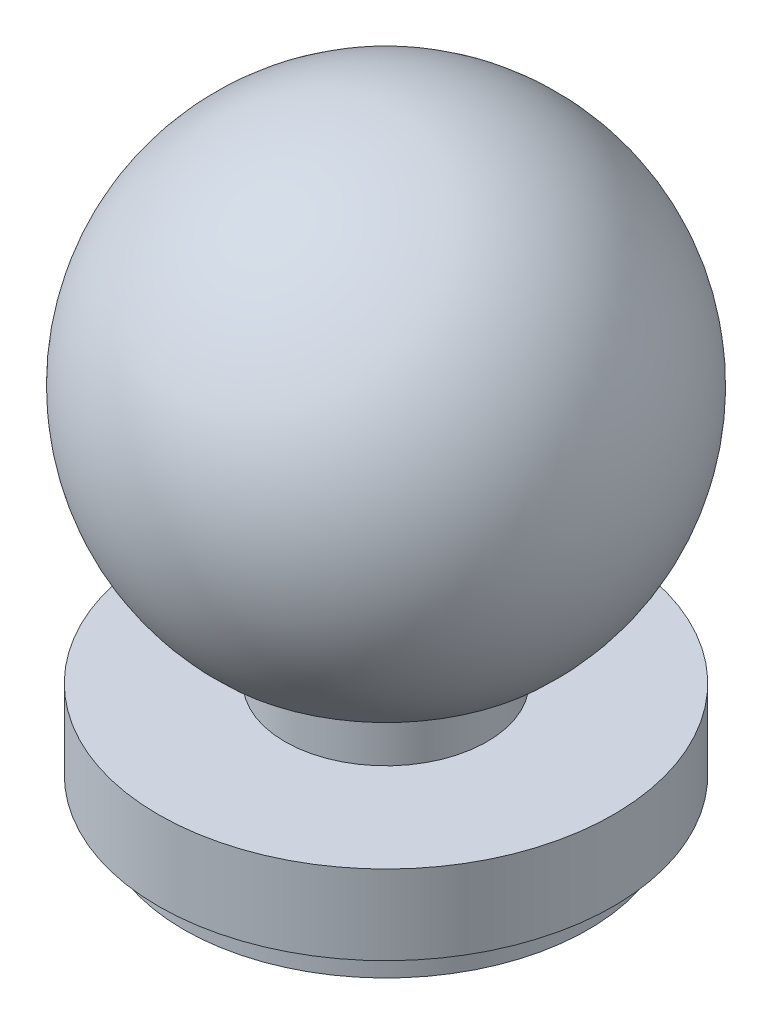
ISO-10303-21;
HEADER;
FILE_DESCRIPTION(('STEP AP214'),'2;1');
FILE_NAME('part.step','',(''),(''),'','','');
FILE_SCHEMA(('AUTOMOTIVE_DESIGN { 1 0 10303 214 1 1 1 1 }'));
ENDSEC;
DATA;
#1=APPLICATION_CONTEXT('core data for automotive mechanical design processes');
#2=APPLICATION_PROTOCOL_DEFINITION('international standard','automotive_design',2000,#1);
#3=PRODUCT_CONTEXT('',#1,'mechanical');
#4=PRODUCT('Part','Part','',(#3));
#5=PRODUCT_RELATED_PRODUCT_CATEGORY('part','',(#4));
#6=PRODUCT_DEFINITION_FORMATION('','',#4);
#7=PRODUCT_DEFINITION_CONTEXT('part definition',#1,'design');
#8=PRODUCT_DEFINITION('design','',#6,#7);
#9=PRODUCT_DEFINITION_SHAPE('','',#8);
#10=(LENGTH_UNIT() NAMED_UNIT(*) SI_UNIT(.MILLI.,.METRE.));
#11=(NAMED_UNIT(*) PLANE_ANGLE_UNIT() SI_UNIT($,.RADIAN.));
#12=(NAMED_UNIT(*) SI_UNIT($,.STERADIAN.) SOLID_ANGLE_UNIT());
#13=UNCERTAINTY_MEASURE_WITH_UNIT(LENGTH_MEASURE(1.E-05),#10,'distance_accuracy_value','');
#14=(GEOMETRIC_REPRESENTATION_CONTEXT(3) GLOBAL_UNCERTAINTY_ASSIGNED_CONTEXT((#13)) GLOBAL_UNIT_ASSIGNED_CONTEXT((#10,
#11,#12)) REPRESENTATION_CONTEXT('',''));
#15=CARTESIAN_POINT('',(0.,0.,0.));
#16=DIRECTION('',(0.,0.,1.));
#17=DIRECTION('',(1.,0.,0.));
#18=AXIS2_PLACEMENT_3D('',#15,#16,#17);
#19=CARTESIAN_POINT('',(0.,6.67,0.));
#20=DIRECTION('',(0.,-1.,0.));
#21=DIRECTION('',(0.,0.,-1.));
#22=AXIS2_PLACEMENT_3D('',#19,#20,#21);
#23=CYLINDRICAL_SURFACE('',#22,2.);
#24=CARTESIAN_POINT('',(0.,1.57,0.));
#25=DIRECTION('',(0.,1.,0.));
#26=DIRECTION('',(0.,0.,1.));
#27=AXIS2_PLACEMENT_3D('',#24,#25,#26);
#28=CIRCLE('',#27,2.);
#29=CARTESIAN_POINT('',(0.,1.57,2.));
#30=VERTEX_POINT('',#29);
#31=EDGE_CURVE('E38',#30,#30,#28,.T.);
#32=ORIENTED_EDGE('',*,*,#31,.T.);
#33=EDGE_LOOP('',(#32));
#34=FACE_BOUND('',#33,.T.);
#35=CARTESIAN_POINT('',(0.,3.15965813630638,0.));
#36=DIRECTION('',(0.,1.,0.));
#37=DIRECTION('',(0.,0.,1.));
#38=AXIS2_PLACEMENT_3D('',#35,#36,#37);
#39=CIRCLE('',#38,2.);
#40=CARTESIAN_POINT('',(0.,3.15965813630638,2.));
#41=VERTEX_POINT('',#40);
#42=EDGE_CURVE('E48',#41,#41,#39,.T.);
#43=ORIENTED_EDGE('',*,*,#42,.F.);
#44=EDGE_LOOP('',(#43));
#45=FACE_BOUND('',#44,.T.);
#46=ADVANCED_FACE('F30',(#34,#45),#23,.T.);
#47=CARTESIAN_POINT('',(0.,1.57,0.));
#48=DIRECTION('',(0.,-1.,0.));
#49=DIRECTION('',(0.,0.,-1.));
#50=AXIS2_PLACEMENT_3D('',#47,#48,#49);
#51=CYLINDRICAL_SURFACE('',#50,4.5);
#52=CARTESIAN_POINT('',(0.,1.57,0.));
#53=DIRECTION('',(0.,1.,0.));
#54=DIRECTION('',(0.,0.,1.));
#55=AXIS2_PLACEMENT_3D('',#52,#53,#54);
#56=CIRCLE('',#55,4.5);
#57=CARTESIAN_POINT('',(0.,1.57,4.5));
#58=VERTEX_POINT('',#57);
#59=EDGE_CURVE('E43',#58,#58,#56,.T.);
#60=ORIENTED_EDGE('',*,*,#59,.F.);
#61=EDGE_LOOP('',(#60));
#62=FACE_BOUND('',#61,.T.);
#63=CARTESIAN_POINT('',(0.,0.,0.));
#64=DIRECTION('',(0.,1.,0.));
#65=DIRECTION('',(0.,0.,1.));
#66=AXIS2_PLACEMENT_3D('',#63,#64,#65);
#67=CIRCLE('',#66,4.5);
#68=CARTESIAN_POINT('',(0.,0.,4.5));
#69=VERTEX_POINT('',#68);
#70=EDGE_CURVE('E34',#69,#69,#67,.T.);
#71=ORIENTED_EDGE('',*,*,#70,.T.);
#72=EDGE_LOOP('',(#71));
#73=FACE_BOUND('',#72,.T.);
#74=ADVANCED_FACE('F32',(#62,#73),#51,.T.);
#75=CARTESIAN_POINT('',(0.,1.57,0.));
#76=DIRECTION('',(0.,1.,0.));
#77=DIRECTION('',(0.,0.,1.));
#78=AXIS2_PLACEMENT_3D('',#75,#76,#77);
#79=PLANE('',#78);
#80=ORIENTED_EDGE('',*,*,#31,.F.);
#81=EDGE_LOOP('',(#80));
#82=FACE_BOUND('',#81,.T.);
#83=ORIENTED_EDGE('',*,*,#59,.T.);
#84=EDGE_LOOP('',(#83));
#85=FACE_BOUND('',#84,.T.);
#86=ADVANCED_FACE('F63',(#82,#85),#79,.T.);
#87=CARTESIAN_POINT('',(0.,0.,0.));
#88=DIRECTION('',(0.,1.,0.));
#89=DIRECTION('',(0.,0.,1.));
#90=AXIS2_PLACEMENT_3D('',#87,#88,#89);
#91=PLANE('',#90);
#92=CARTESIAN_POINT('',(0.,0.,0.));
#93=DIRECTION('',(0.,-1.,0.));
#94=DIRECTION('',(0.,0.,-1.));
#95=AXIS2_PLACEMENT_3D('',#92,#93,#94);
#96=CIRCLE('',#95,4.);
#97=CARTESIAN_POINT('',(0.,0.,-4.));
#98=VERTEX_POINT('',#97);
#99=EDGE_CURVE('E10',#98,#98,#96,.T.);
#100=ORIENTED_EDGE('',*,*,#99,.F.);
#101=EDGE_LOOP('',(#100));
#102=FACE_BOUND('',#101,.T.);
#103=ORIENTED_EDGE('',*,*,#70,.F.);
#104=EDGE_LOOP('',(#103));
#105=FACE_BOUND('',#104,.T.);
#106=ADVANCED_FACE('F60',(#102,#105),#91,.F.);
#107=CARTESIAN_POINT('',(2.,3.15965813630638,0.));
#108=DIRECTION('',(0.,-1.,0.));
#109=DIRECTION('',(0.,0.,-1.));
#110=AXIS2_PLACEMENT_3D('',#107,#108,#109);
#111=PLANE('',#110);
#112=ORIENTED_EDGE('',*,*,#42,.T.);
#113=EDGE_LOOP('',(#112));
#114=FACE_BOUND('',#113,.T.);
#115=CARTESIAN_POINT('',(0.,3.15965813630638,0.));
#116=DIRECTION('',(0.,1.,0.));
#117=DIRECTION('',(0.,0.,1.));
#118=AXIS2_PLACEMENT_3D('',#115,#116,#117);
#119=CIRCLE('',#118,3.2);
#120=CARTESIAN_POINT('',(0.,3.15965813630638,3.2));
#121=VERTEX_POINT('',#120);
#122=EDGE_CURVE('E51',#121,#121,#119,.T.);
#123=ORIENTED_EDGE('',*,*,#122,.F.);
#124=EDGE_LOOP('',(#123));
#125=FACE_BOUND('',#124,.T.);
#126=ADVANCED_FACE('F62',(#114,#125),#111,.T.);
#127=CARTESIAN_POINT('',(0.,6.67,0.));
#128=DIRECTION('',(0.,0.,-1.));
#129=DIRECTION('',(1.,0.,0.));
#130=AXIS2_PLACEMENT_3D('',#127,#128,#129);
#131=SPHERICAL_SURFACE('',#130,4.75);
#132=CARTESIAN_POINT('',(0.,6.67,0.));
#133=DIRECTION('',(0.,1.,0.));
#134=DIRECTION('',(0.,0.,1.));
#135=AXIS2_PLACEMENT_3D('',#132,#133,#134);
#136=SPHERICAL_SURFACE('',#135,4.75);
#137=ORIENTED_EDGE('',*,*,#122,.T.);
#138=EDGE_LOOP('',(#137));
#139=FACE_BOUND('',#138,.T.);
#140=ADVANCED_FACE('F69',(#139),#136,.T.);
#141=CARTESIAN_POINT('',(0.,-0.65,0.));
#142=DIRECTION('',(0.,1.,0.));
#143=DIRECTION('',(0.,0.,1.));
#144=AXIS2_PLACEMENT_3D('',#141,#142,#143);
#145=CYLINDRICAL_SURFACE('',#144,4.);
#146=CARTESIAN_POINT('',(0.,-0.65,0.));
#147=DIRECTION('',(0.,-1.,0.));
#148=DIRECTION('',(0.,0.,-1.));
#149=AXIS2_PLACEMENT_3D('',#146,#147,#148);
#150=CIRCLE('',#149,4.);
#151=CARTESIAN_POINT('',(0.,-0.65,-4.));
#152=VERTEX_POINT('',#151);
#153=EDGE_CURVE('E47',#152,#152,#150,.T.);
#154=ORIENTED_EDGE('',*,*,#153,.F.);
#155=EDGE_LOOP('',(#154));
#156=FACE_BOUND('',#155,.T.);
#157=ORIENTED_EDGE('',*,*,#99,.T.);
#158=EDGE_LOOP('',(#157));
#159=FACE_BOUND('',#158,.T.);
#160=ADVANCED_FACE('F84',(#156,#159),#145,.T.);
#161=CARTESIAN_POINT('',(0.,-0.65,0.));
#162=DIRECTION('',(0.,-1.,0.));
#163=DIRECTION('',(0.,0.,-1.));
#164=AXIS2_PLACEMENT_3D('',#161,#162,#163);
#165=PLANE('',#164);
#166=ORIENTED_EDGE('',*,*,#153,.T.);
#167=EDGE_LOOP('',(#166));
#168=FACE_BOUND('',#167,.T.);
#169=ADVANCED_FACE('F89',(#168),#165,.T.);
#170=CLOSED_SHELL('',(#46,#74,#86,#106,#126,#140,#160,#169));
#171=MANIFOLD_SOLID_BREP('B2',#170);
#172=ADVANCED_BREP_SHAPE_REPRESENTATION('',(#18,#171),#14);
#173=SHAPE_DEFINITION_REPRESENTATION(#9,#172);
ENDSEC;
END-ISO-10303-21;
